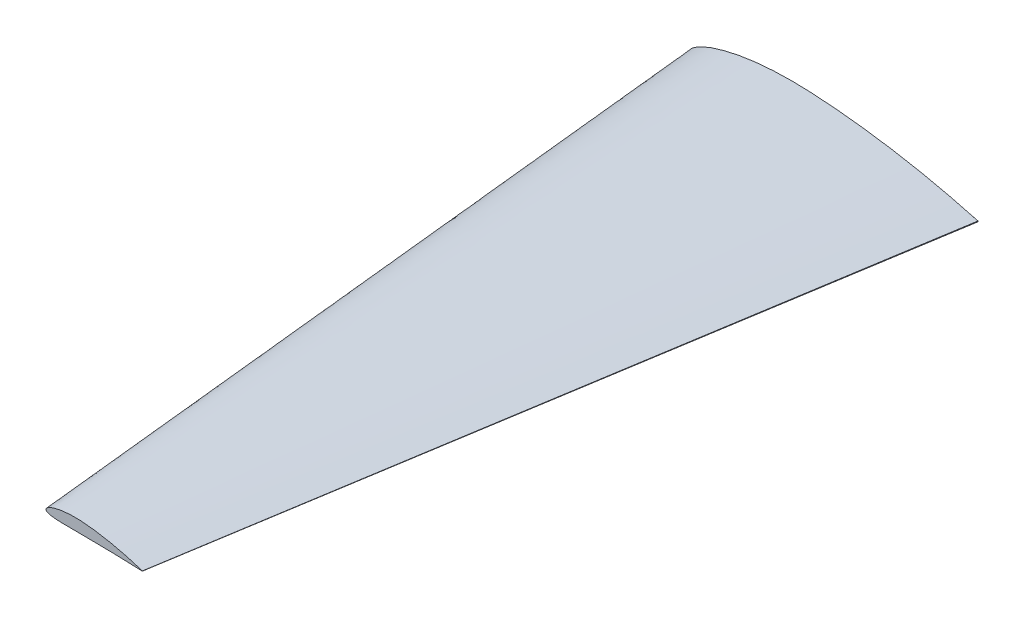
ISO-10303-21;
HEADER;
FILE_DESCRIPTION(('STEP AP214'),'2;1');
FILE_NAME('part.step','',(''),(''),'','','');
FILE_SCHEMA(('AUTOMOTIVE_DESIGN { 1 0 10303 214 1 1 1 1 }'));
ENDSEC;
DATA;
#1=APPLICATION_CONTEXT('core data for automotive mechanical design processes');
#2=APPLICATION_PROTOCOL_DEFINITION('international standard','automotive_design',2000,#1);
#3=PRODUCT_CONTEXT('',#1,'mechanical');
#4=PRODUCT('Part','Part','',(#3));
#5=PRODUCT_RELATED_PRODUCT_CATEGORY('part','',(#4));
#6=PRODUCT_DEFINITION_FORMATION('','',#4);
#7=PRODUCT_DEFINITION_CONTEXT('part definition',#1,'design');
#8=PRODUCT_DEFINITION('design','',#6,#7);
#9=PRODUCT_DEFINITION_SHAPE('','',#8);
#10=(LENGTH_UNIT() NAMED_UNIT(*) SI_UNIT(.MILLI.,.METRE.));
#11=(NAMED_UNIT(*) PLANE_ANGLE_UNIT() SI_UNIT($,.RADIAN.));
#12=(NAMED_UNIT(*) SI_UNIT($,.STERADIAN.) SOLID_ANGLE_UNIT());
#13=UNCERTAINTY_MEASURE_WITH_UNIT(LENGTH_MEASURE(1.E-05),#10,'distance_accuracy_value','');
#14=(GEOMETRIC_REPRESENTATION_CONTEXT(3) GLOBAL_UNCERTAINTY_ASSIGNED_CONTEXT((#13)) GLOBAL_UNIT_ASSIGNED_CONTEXT((#10,
#11,#12)) REPRESENTATION_CONTEXT('',''));
#15=CARTESIAN_POINT('',(0.,0.,0.));
#16=DIRECTION('',(0.,0.,1.));
#17=DIRECTION('',(1.,0.,0.));
#18=AXIS2_PLACEMENT_3D('',#15,#16,#17);
#19=CARTESIAN_POINT('',(5046.62444198474,563.879421682636,45000.));
#20=DIRECTION('',(0.,0.,-1.));
#21=DIRECTION('',(-1.,0.,0.));
#22=AXIS2_PLACEMENT_3D('',#19,#20,#21);
#23=PLANE('',#22);
#24=CARTESIAN_POINT('',(11016.8038358006,175.662220236248,45000.));
#25=CARTESIAN_POINT('',(11013.8238706951,176.657627238535,45000.));
#26=CARTESIAN_POINT('',(11001.9271551493,180.631524092771,45000.));
#27=CARTESIAN_POINT('',(10975.227247583,189.540370854684,45000.));
#28=CARTESIAN_POINT('',(10930.8719876282,204.188638264243,45000.));
#29=CARTESIAN_POINT('',(10869.1028475947,224.367251974922,45000.));
#30=CARTESIAN_POINT('',(10790.240197561,249.721214038469,45000.));
#31=CARTESIAN_POINT('',(10694.7071670468,279.852444771577,45000.));
#32=CARTESIAN_POINT('',(10583.0107951592,314.25724887763,45000.));
#33=CARTESIAN_POINT('',(10455.7658081857,352.424928205808,45000.));
#34=CARTESIAN_POINT('',(10313.6645243874,393.743241395522,45000.));
#35=CARTESIAN_POINT('',(10157.5038937566,437.61179958158,45000.));
#36=CARTESIAN_POINT('',(9988.16790311371,483.397295715831,45000.));
#37=CARTESIAN_POINT('',(9806.62258777869,530.438712455231,45000.));
#38=CARTESIAN_POINT('',(9613.9206331239,578.086856055864,45000.));
#39=CARTESIAN_POINT('',(9411.18705103645,625.683245725675,45000.));
#40=CARTESIAN_POINT('',(9199.62707490729,672.608611532407,45000.));
#41=CARTESIAN_POINT('',(8980.49871389045,718.206148862946,45000.));
#42=CARTESIAN_POINT('',(8755.12853528402,761.887650567427,45000.));
#43=CARTESIAN_POINT('',(8524.88852400964,803.055073268356,45000.));
#44=CARTESIAN_POINT('',(8291.19753823506,841.16709564249,45000.));
#45=CARTESIAN_POINT('',(8055.50670066197,875.681825668917,45000.));
#46=CARTESIAN_POINT('',(7819.29777675795,906.160762137395,45000.));
#47=CARTESIAN_POINT('',(7583.52793924022,932.16759647092,45000.));
#48=CARTESIAN_POINT('',(7349.0019488898,953.640706489979,45000.));
#49=CARTESIAN_POINT('',(7117.01517974219,967.459136040717,45000.));
#50=CARTESIAN_POINT('',(6889.75927460565,973.713744382,45000.));
#51=CARTESIAN_POINT('',(6669.52967646175,972.412306138709,45000.));
#52=CARTESIAN_POINT('',(6457.89509045152,963.836313841872,45000.));
#53=CARTESIAN_POINT('',(6256.36653642584,948.401623210838,45000.));
#54=CARTESIAN_POINT('',(6066.3666830865,926.647155129574,45000.));
#55=CARTESIAN_POINT('',(5889.23129506125,899.215177324151,45000.));
#56=CARTESIAN_POINT('',(5726.16725610352,866.882517038113,45000.));
#57=CARTESIAN_POINT('',(5578.2639607925,830.466340030042,45000.));
#58=CARTESIAN_POINT('',(5446.45986918676,790.830692752215,45000.));
#59=CARTESIAN_POINT('',(5331.54550327665,748.847706817672,45000.));
#60=CARTESIAN_POINT('',(5234.12689908883,705.372238642089,45000.));
#61=CARTESIAN_POINT('',(5154.63423606412,661.169496243238,45000.));
#62=CARTESIAN_POINT('',(5093.24012040514,616.816631391022,45000.));
#63=CARTESIAN_POINT('',(5049.90913796763,572.56653701901,45000.));
#64=CARTESIAN_POINT('',(5024.63929694074,527.608998184188,45000.));
#65=CARTESIAN_POINT('',(5020.17031135847,481.738654851406,45000.));
#66=CARTESIAN_POINT('',(5037.52570607464,439.134452359693,45000.));
#67=CARTESIAN_POINT('',(5074.07960988172,403.188963301013,45000.));
#68=CARTESIAN_POINT('',(5127.10419251011,372.557418098199,45000.));
#69=CARTESIAN_POINT('',(5196.64772829925,346.121915624728,45000.));
#70=CARTESIAN_POINT('',(5282.4915169243,323.532348684396,45000.));
#71=CARTESIAN_POINT('',(5384.22450862548,304.609019147802,45000.));
#72=CARTESIAN_POINT('',(5501.22322457257,289.204760371054,45000.));
#73=CARTESIAN_POINT('',(5632.74423119377,277.058590565351,45000.));
#74=CARTESIAN_POINT('',(5777.97145395365,267.923893569997,45000.));
#75=CARTESIAN_POINT('',(5936.01888618687,261.426029066467,45000.));
#76=CARTESIAN_POINT('',(6105.96028140851,257.165599955122,45000.));
#77=CARTESIAN_POINT('',(6286.82797064515,254.680445326503,45000.));
#78=CARTESIAN_POINT('',(6477.61628635329,253.447275004693,45000.));
#79=CARTESIAN_POINT('',(6677.28900613625,252.928162568892,45000.));
#80=CARTESIAN_POINT('',(6884.77024356208,252.569464820474,45000.));
#81=CARTESIAN_POINT('',(7098.95099407701,251.77941384682,45000.));
#82=CARTESIAN_POINT('',(7319.37877838889,250.077946129556,45000.));
#83=CARTESIAN_POINT('',(7545.36587973962,246.675283655304,45000.));
#84=CARTESIAN_POINT('',(7775.65160502419,244.007368227557,45000.));
#85=CARTESIAN_POINT('',(8008.16968243336,241.497238491779,45000.));
#86=CARTESIAN_POINT('',(8240.98559300548,238.966955247815,45000.));
#87=CARTESIAN_POINT('',(8472.69656296,236.18608009988,45000.));
#88=CARTESIAN_POINT('',(8701.89090570681,233.020542928767,45000.));
#89=CARTESIAN_POINT('',(8927.16322744528,229.3547831871,45000.));
#90=CARTESIAN_POINT('',(9147.12321082592,225.153795541316,45000.));
#91=CARTESIAN_POINT('',(9360.40325730438,220.426952399602,45000.));
#92=CARTESIAN_POINT('',(9565.6683928176,215.239469723458,45000.));
#93=CARTESIAN_POINT('',(9761.61908285512,209.669383936778,45000.));
#94=CARTESIAN_POINT('',(9947.01408470072,203.849892297003,45000.));
#95=CARTESIAN_POINT('',(10120.6648946521,197.91682065144,45000.));
#96=CARTESIAN_POINT('',(10281.4540059651,192.027799228579,45000.));
#97=CARTESIAN_POINT('',(10428.3328546008,186.307516445477,45000.));
#98=CARTESIAN_POINT('',(10560.338594395,180.924898710908,45000.));
#99=CARTESIAN_POINT('',(10676.5981472564,175.99075423297,45000.));
#100=CARTESIAN_POINT('',(10776.3350346384,171.633699664281,45000.));
#101=CARTESIAN_POINT('',(10858.8809220008,167.937636087378,45000.));
#102=CARTESIAN_POINT('',(10923.6749036572,164.977071033585,45000.));
#103=CARTESIAN_POINT('',(10970.2772887048,162.846735624516,45000.));
#104=CARTESIAN_POINT('',(10998.3639129717,161.509489926778,45000.));
#105=CARTESIAN_POINT('',(11011.5516219352,160.931286929275,45000.));
#106=CARTESIAN_POINT('',(11015.3523575084,160.730075398698,45000.));
#107=CARTESIAN_POINT('',(11016.0194244884,160.694760769346,45000.));
#108=B_SPLINE_CURVE_WITH_KNOTS('',3,(#24,#25,#26,#27,#28,#29,#30,#31,#32,#33,#34,#35,#36,#37,
#38,#39,#40,#41,#42,#43,#44,#45,#46,#47,#48,#49,#50,#51,#52,#53,#54,#55,#56,#57,#58,#59,#60,#61,
#62,#63,#64,#65,#66,#67,#68,#69,#70,#71,#72,#73,#74,#75,#76,#77,#78,#79,#80,#81,#82,#83,#84,#85,
#86,#87,#88,#89,#90,#91,#92,#93,#94,#95,#96,#97,#98,#99,#100,#101,#102,#103,#104,#105,#106,
#107),.UNSPECIFIED.,.F.,.F.,(4,1,1,1,1,1,1,1,1,1,1,1,1,1,1,1,1,1,1,1,1,1,1,1,1,1,1,1,1,1,1,1,1,
1,1,1,1,1,1,1,1,1,1,1,1,1,1,1,1,1,1,1,1,1,1,1,1,1,1,1,1,1,1,1,1,1,1,1,1,1,1,1,1,1,1,1,1,1,1,1,1,
4),(0.,0.000767121254640261,0.00306252691977081,0.00687249500422591,0.0121723886211334,
0.0189286897776406,0.0270985273547925,0.0366307244648695,0.0474652014577101,0.0595344883078078,
0.0727633066210751,0.0870694437086077,0.102364288210113,0.118553276218277,0.135536378611135,
0.153209328906051,0.171462740540865,0.190184209716801,0.209258972509244,0.228568672546341,
0.247994708125301,0.267417510782052,0.286717382026135,0.305907975532352,0.324913732729971,
0.343450270527452,0.361407243443232,0.37867648926581,0.395155680852941,0.410746411858504,
0.425359257634746,0.438909317349477,0.451323091037229,0.462536328216232,0.472498522944067,
0.481175411965611,0.488557733265764,0.494670875888975,0.499607077860304,0.503582011567533,
0.507027067193182,0.510471717375482,0.514433585416291,0.519323420502367,0.525336376275755,
0.532547811911357,0.540971207547999,0.550585893045097,0.561351783213653,0.573214660035621,
0.586111603768396,0.599971786160278,0.614720131432056,0.630276669804401,0.646556306621168,
0.663473292221445,0.680936327350333,0.698852005706235,0.717295175424184,0.736120434794262,
0.755083389680044,0.77407118766486,0.792969208077575,0.811663076825591,0.830037642898592,
0.847979966615464,0.86537924877782,0.882125799542238,0.898114379916224,0.913242734866341,
0.927414941899802,0.940538465376043,0.952528040305874,0.963304728991663,0.972796370859253,
0.98094005879009,0.987680175393795,0.992971347205831,0.996776972988148,0.999070696658573,
0.99983689800001,1.),.UNSPECIFIED.);
#109=CARTESIAN_POINT('',(11016.8038358006,175.662220236248,45000.));
#110=VERTEX_POINT('',#109);
#111=CARTESIAN_POINT('',(11016.0194244884,160.694760769346,45000.));
#112=VERTEX_POINT('',#111);
#113=EDGE_CURVE('E68',#110,#112,#108,.T.);
#114=ORIENTED_EDGE('',*,*,#113,.T.);
#115=DIRECTION('',(0.0523359562429645,0.998629534754573,0.));
#116=VECTOR('',#115,1.);
#117=CARTESIAN_POINT('',(11016.8038358006,175.662220236248,45000.));
#118=LINE('',#117,#116);
#119=EDGE_CURVE('E12',#112,#110,#118,.T.);
#120=ORIENTED_EDGE('',*,*,#119,.T.);
#121=EDGE_LOOP('',(#114,#120));
#122=FACE_BOUND('',#121,.T.);
#123=ADVANCED_FACE('F58',(#122),#23,.F.);
#124=CARTESIAN_POINT('',(56.0604332540928,248.172347240574,0.));
#125=DIRECTION('',(0.,0.,-1.));
#126=DIRECTION('',(-1.,0.,0.));
#127=AXIS2_PLACEMENT_3D('',#124,#125,#126);
#128=PLANE('',#127);
#129=CARTESIAN_POINT('',(18003.006,22.482,0.));
#130=CARTESIAN_POINT('',(17993.9220697674,24.9962505246562,0.));
#131=CARTESIAN_POINT('',(17957.6569021601,35.0337248720699,0.));
#132=CARTESIAN_POINT('',(17876.2681943043,57.5315417809718,0.));
#133=CARTESIAN_POINT('',(17741.08488322,94.4519943530551,0.));
#134=CARTESIAN_POINT('',(17552.863219366,145.206632188856,0.));
#135=CARTESIAN_POINT('',(17312.6187332804,208.782221603863,0.));
#136=CARTESIAN_POINT('',(17021.6815755125,284.052594875379,0.));
#137=CARTESIAN_POINT('',(16681.6498628702,369.588346133817,0.));
#138=CARTESIAN_POINT('',(16294.4454304608,463.955997473154,0.));
#139=CARTESIAN_POINT('',(15862.2385133852,565.430041392831,0.));
#140=CARTESIAN_POINT('',(15387.5109508185,672.33690715322,0.));
#141=CARTESIAN_POINT('',(14873.0105029931,782.918070272461,0.));
#142=CARTESIAN_POINT('',(14321.7350890392,895.344871571994,0.));
#143=CARTESIAN_POINT('',(13736.940365594,1007.83767879923,0.));
#144=CARTESIAN_POINT('',(13122.1001296153,1118.60039257179,0.));
#145=CARTESIAN_POINT('',(12480.9223563371,1225.96698028273,0.));
#146=CARTESIAN_POINT('',(11817.2790245401,1328.16724581248,0.));
#147=CARTESIAN_POINT('',(11135.2367352268,1423.64726756803,0.));
#148=CARTESIAN_POINT('',(10438.999699905,1510.83078663836,0.));
#149=CARTESIAN_POINT('',(9732.90365129785,1588.31883653686,0.));
#150=CARTESIAN_POINT('',(9021.38107268206,1654.71580681601,0.));
#151=CARTESIAN_POINT('',(8308.94001647658,1708.9406455351,0.));
#152=CARTESIAN_POINT('',(7598.51656939702,1749.83650444868,0.));
#153=CARTESIAN_POINT('',(6892.53138026345,1777.34512414645,0.));
#154=CARTESIAN_POINT('',(6195.35526006124,1782.31985156917,0.));
#155=CARTESIAN_POINT('',(5513.53986088564,1765.37699610142,0.));
#156=CARTESIAN_POINT('',(4853.96085352959,1726.90025226361,0.));
#157=CARTESIAN_POINT('',(4221.27370730624,1667.97923937249,0.));
#158=CARTESIAN_POINT('',(3619.93997674745,1590.09705684506,0.));
#159=CARTESIAN_POINT('',(3054.13720398511,1495.09162179699,0.));
#160=CARTESIAN_POINT('',(2527.76634995866,1385.096822347,0.));
#161=CARTESIAN_POINT('',(2044.32113596184,1262.62943662746,0.));
#162=CARTESIAN_POINT('',(1606.93696534578,1130.30864574338,0.));
#163=CARTESIAN_POINT('',(1218.2896978136,990.870382228364,0.));
#164=CARTESIAN_POINT('',(880.610717661754,847.051573416231,0.));
#165=CARTESIAN_POINT('',(595.581422132434,701.508426325905,0.));
#166=CARTESIAN_POINT('',(364.370437230143,556.600960494894,0.));
#167=CARTESIAN_POINT('',(187.404254541008,414.085358865581,0.));
#168=CARTESIAN_POINT('',(64.5370710533379,274.713700196437,0.));
#169=CARTESIAN_POINT('',(-4.10987035494065,136.058358042702,0.));
#170=CARTESIAN_POINT('',(-10.2964484889275,-2.06574672329666,0.));
#171=CARTESIAN_POINT('',(48.3875757958354,-126.978257926631,0.));
#172=CARTESIAN_POINT('',(163.542724280357,-228.927688441748,0.));
#173=CARTESIAN_POINT('',(327.207860750736,-312.371108937129,0.));
#174=CARTESIAN_POINT('',(539.703129023767,-380.650047207266,0.));
#175=CARTESIAN_POINT('',(800.428296873182,-434.84772308343,0.));
#176=CARTESIAN_POINT('',(1108.18011902821,-475.567030190427,0.));
#177=CARTESIAN_POINT('',(1461.11382868748,-503.346754481954,0.));
#178=CARTESIAN_POINT('',(1857.04315787962,-519.085493245649,0.));
#179=CARTESIAN_POINT('',(2293.56195888155,-523.650211150495,0.));
#180=CARTESIAN_POINT('',(2768.07467589918,-518.302398875668,0.));
#181=CARTESIAN_POINT('',(3277.86908613102,-504.384033627065,0.));
#182=CARTESIAN_POINT('',(3820.11872402627,-483.431629649826,0.));
#183=CARTESIAN_POINT('',(4391.89288232696,-457.170803736354,0.));
#184=CARTESIAN_POINT('',(4990.17161284425,-427.37581859069,0.));
#185=CARTESIAN_POINT('',(5611.81860601584,-395.874250198099,0.));
#186=CARTESIAN_POINT('',(6253.60431995573,-364.613091745766,0.));
#187=CARTESIAN_POINT('',(6914.24855085877,-335.101602867013,0.));
#188=CARTESIAN_POINT('',(7591.8149772891,-309.813847454495,0.));
#189=CARTESIAN_POINT('',(8282.14424110902,-281.649953956018,0.));
#190=CARTESIAN_POINT('',(8979.1366096245,-252.662855251721,0.));
#191=CARTESIAN_POINT('',(9677.02441737823,-223.68937206278,0.));
#192=CARTESIAN_POINT('',(10371.641291028,-195.64011867471,0.));
#193=CARTESIAN_POINT('',(11058.7790248695,-169.138400132639,0.));
#194=CARTESIAN_POINT('',(11734.2453595462,-144.751080848916,0.));
#195=CARTESIAN_POINT('',(12393.8805552671,-122.801323667347,0.));
#196=CARTESIAN_POINT('',(13033.5859675962,-103.47577362978,0.));
#197=CARTESIAN_POINT('',(13649.351923532,-86.7886524127904,0.));
#198=CARTESIAN_POINT('',(14237.272910111,-72.7102087271436,0.));
#199=CARTESIAN_POINT('',(14793.6093894072,-61.0362833005955,0.));
#200=CARTESIAN_POINT('',(15314.7794109959,-51.5465614583088,0.));
#201=CARTESIAN_POINT('',(15797.4102999706,-43.9442579472748,0.));
#202=CARTESIAN_POINT('',(16238.3410982139,-38.0204529646997,0.));
#203=CARTESIAN_POINT('',(16634.6607030993,-33.4202362317489,0.));
#204=CARTESIAN_POINT('',(16983.736072162,-29.9487188308591,0.));
#205=CARTESIAN_POINT('',(17283.2207683463,-27.3424928398559,0.));
#206=CARTESIAN_POINT('',(17531.0993626893,-25.455133743419,0.));
#207=CARTESIAN_POINT('',(17725.6797459678,-24.1514918839373,0.));
#208=CARTESIAN_POINT('',(17865.6297796858,-23.2167983052178,0.));
#209=CARTESIAN_POINT('',(17949.9841353559,-22.8132164362509,0.));
#210=CARTESIAN_POINT('',(17989.5838247764,-22.474874129643,0.));
#211=CARTESIAN_POINT('',(18001.0019969618,-22.4809360691834,0.));
#212=CARTESIAN_POINT('',(18003.006,-22.482,0.));
#213=B_SPLINE_CURVE_WITH_KNOTS('',3,(#129,#130,#131,#132,#133,#134,#135,#136,#137,#138,#139,
#140,#141,#142,#143,#144,#145,#146,#147,#148,#149,#150,#151,#152,#153,#154,#155,#156,#157,#158,
#159,#160,#161,#162,#163,#164,#165,#166,#167,#168,#169,#170,#171,#172,#173,#174,#175,#176,#177,
#178,#179,#180,#181,#182,#183,#184,#185,#186,#187,#188,#189,#190,#191,#192,#193,#194,#195,#196,
#197,#198,#199,#200,#201,#202,#203,#204,#205,#206,#207,#208,#209,#210,#211,#212),.UNSPECIFIED.,
.F.,.F.,(4,1,1,1,1,1,1,1,1,1,1,1,1,1,1,1,1,1,1,1,1,1,1,1,1,1,1,1,1,1,1,1,1,1,1,1,1,1,1,1,1,1,1,
1,1,1,1,1,1,1,1,1,1,1,1,1,1,1,1,1,1,1,1,1,1,1,1,1,1,1,1,1,1,1,1,1,1,1,1,1,1,4),(0.,
0.000767121254640261,0.00306252691977081,0.00687249500422591,0.0121723886211334,
0.0189286897776406,0.0270985273547925,0.0366307244648695,0.0474652014577101,0.0595344883078078,
0.0727633066210751,0.0870694437086077,0.102364288210113,0.118553276218277,0.135536378611135,
0.153209328906051,0.171462740540865,0.190184209716801,0.209258972509244,0.228568672546341,
0.247994708125301,0.267417510782052,0.286717382026135,0.305907975532352,0.324913732729971,
0.343450270527452,0.361407243443232,0.37867648926581,0.395155680852941,0.410746411858504,
0.425359257634746,0.438909317349477,0.451323091037229,0.462536328216232,0.472498522944067,
0.481175411965611,0.488557733265764,0.494670875888975,0.499607077860304,0.503582011567533,
0.507027067193182,0.510471717375482,0.514433585416291,0.519323420502367,0.525336376275755,
0.532547811911357,0.540971207547999,0.550585893045097,0.561351783213653,0.573214660035621,
0.586111603768396,0.599971786160278,0.614720131432056,0.630276669804401,0.646556306621168,
0.663473292221445,0.680936327350333,0.698852005706235,0.717295175424184,0.736120434794262,
0.755083389680044,0.77407118766486,0.792969208077575,0.811663076825591,0.830037642898592,
0.847979966615464,0.86537924877782,0.882125799542238,0.898114379916224,0.913242734866341,
0.927414941899802,0.940538465376043,0.952528040305874,0.963304728991663,0.972796370859253,
0.98094005879009,0.987680175393795,0.992971347205831,0.996776972988148,0.999070696658573,
0.99983689800001,1.),.UNSPECIFIED.);
#214=CARTESIAN_POINT('',(18003.006,22.482,0.));
#215=VERTEX_POINT('',#214);
#216=CARTESIAN_POINT('',(18003.006,-22.482,0.));
#217=VERTEX_POINT('',#216);
#218=EDGE_CURVE('E92',#215,#217,#213,.T.);
#219=ORIENTED_EDGE('',*,*,#218,.F.);
#220=DIRECTION('',(0.,1.,0.));
#221=VECTOR('',#220,1.);
#222=CARTESIAN_POINT('',(18003.006,22.482,0.));
#223=LINE('',#222,#221);
#224=EDGE_CURVE('E96',#217,#215,#223,.T.);
#225=ORIENTED_EDGE('',*,*,#224,.F.);
#226=EDGE_LOOP('',(#219,#225));
#227=FACE_BOUND('',#226,.T.);
#228=ADVANCED_FACE('F105',(#227),#128,.T.);
#229=CARTESIAN_POINT('',(18003.006,22.482,0.));
#230=CARTESIAN_POINT('',(11016.8038358006,175.662220236248,45000.));
#231=CARTESIAN_POINT('',(17993.9220697674,24.9962505246562,0.));
#232=CARTESIAN_POINT('',(11013.8238706951,176.657627238535,45000.));
#233=CARTESIAN_POINT('',(17957.6569021601,35.0337248720699,0.));
#234=CARTESIAN_POINT('',(11001.9271551493,180.631524092771,45000.));
#235=CARTESIAN_POINT('',(17876.2681943043,57.5315417809718,0.));
#236=CARTESIAN_POINT('',(10975.227247583,189.540370854684,45000.));
#237=CARTESIAN_POINT('',(17741.08488322,94.4519943530551,0.));
#238=CARTESIAN_POINT('',(10930.8719876282,204.188638264243,45000.));
#239=CARTESIAN_POINT('',(17552.863219366,145.206632188856,0.));
#240=CARTESIAN_POINT('',(10869.1028475947,224.367251974922,45000.));
#241=CARTESIAN_POINT('',(17312.6187332804,208.782221603863,0.));
#242=CARTESIAN_POINT('',(10790.240197561,249.721214038469,45000.));
#243=CARTESIAN_POINT('',(17021.6815755125,284.052594875379,0.));
#244=CARTESIAN_POINT('',(10694.7071670468,279.852444771577,45000.));
#245=CARTESIAN_POINT('',(16681.6498628702,369.588346133817,0.));
#246=CARTESIAN_POINT('',(10583.0107951592,314.25724887763,45000.));
#247=CARTESIAN_POINT('',(16294.4454304608,463.955997473154,0.));
#248=CARTESIAN_POINT('',(10455.7658081857,352.424928205808,45000.));
#249=CARTESIAN_POINT('',(15862.2385133852,565.430041392831,0.));
#250=CARTESIAN_POINT('',(10313.6645243874,393.743241395522,45000.));
#251=CARTESIAN_POINT('',(15387.5109508185,672.33690715322,0.));
#252=CARTESIAN_POINT('',(10157.5038937566,437.61179958158,45000.));
#253=CARTESIAN_POINT('',(14873.0105029931,782.918070272461,0.));
#254=CARTESIAN_POINT('',(9988.16790311371,483.397295715831,45000.));
#255=CARTESIAN_POINT('',(14321.7350890392,895.344871571994,0.));
#256=CARTESIAN_POINT('',(9806.62258777869,530.438712455231,45000.));
#257=CARTESIAN_POINT('',(13736.940365594,1007.83767879923,0.));
#258=CARTESIAN_POINT('',(9613.9206331239,578.086856055864,45000.));
#259=CARTESIAN_POINT('',(13122.1001296153,1118.60039257179,0.));
#260=CARTESIAN_POINT('',(9411.18705103645,625.683245725675,45000.));
#261=CARTESIAN_POINT('',(12480.9223563371,1225.96698028273,0.));
#262=CARTESIAN_POINT('',(9199.62707490729,672.608611532407,45000.));
#263=CARTESIAN_POINT('',(11817.2790245401,1328.16724581248,0.));
#264=CARTESIAN_POINT('',(8980.49871389045,718.206148862946,45000.));
#265=CARTESIAN_POINT('',(11135.2367352268,1423.64726756803,0.));
#266=CARTESIAN_POINT('',(8755.12853528402,761.887650567427,45000.));
#267=CARTESIAN_POINT('',(10438.999699905,1510.83078663836,0.));
#268=CARTESIAN_POINT('',(8524.88852400964,803.055073268356,45000.));
#269=CARTESIAN_POINT('',(9732.90365129785,1588.31883653686,0.));
#270=CARTESIAN_POINT('',(8291.19753823506,841.16709564249,45000.));
#271=CARTESIAN_POINT('',(9021.38107268206,1654.71580681601,0.));
#272=CARTESIAN_POINT('',(8055.50670066197,875.681825668917,45000.));
#273=CARTESIAN_POINT('',(8308.94001647658,1708.9406455351,0.));
#274=CARTESIAN_POINT('',(7819.29777675795,906.160762137395,45000.));
#275=CARTESIAN_POINT('',(7598.51656939702,1749.83650444868,0.));
#276=CARTESIAN_POINT('',(7583.52793924022,932.16759647092,45000.));
#277=CARTESIAN_POINT('',(6892.53138026345,1777.34512414645,0.));
#278=CARTESIAN_POINT('',(7349.0019488898,953.640706489979,45000.));
#279=CARTESIAN_POINT('',(6195.35526006124,1782.31985156917,0.));
#280=CARTESIAN_POINT('',(7117.01517974219,967.459136040717,45000.));
#281=CARTESIAN_POINT('',(5513.53986088564,1765.37699610142,0.));
#282=CARTESIAN_POINT('',(6889.75927460565,973.713744382,45000.));
#283=CARTESIAN_POINT('',(4853.96085352959,1726.90025226361,0.));
#284=CARTESIAN_POINT('',(6669.52967646175,972.412306138709,45000.));
#285=CARTESIAN_POINT('',(4221.27370730624,1667.97923937249,0.));
#286=CARTESIAN_POINT('',(6457.89509045152,963.836313841872,45000.));
#287=CARTESIAN_POINT('',(3619.93997674745,1590.09705684506,0.));
#288=CARTESIAN_POINT('',(6256.36653642584,948.401623210838,45000.));
#289=CARTESIAN_POINT('',(3054.13720398511,1495.09162179699,0.));
#290=CARTESIAN_POINT('',(6066.3666830865,926.647155129574,45000.));
#291=CARTESIAN_POINT('',(2527.76634995866,1385.096822347,0.));
#292=CARTESIAN_POINT('',(5889.23129506125,899.215177324151,45000.));
#293=CARTESIAN_POINT('',(2044.32113596184,1262.62943662746,0.));
#294=CARTESIAN_POINT('',(5726.16725610352,866.882517038113,45000.));
#295=CARTESIAN_POINT('',(1606.93696534578,1130.30864574338,0.));
#296=CARTESIAN_POINT('',(5578.2639607925,830.466340030042,45000.));
#297=CARTESIAN_POINT('',(1218.2896978136,990.870382228364,0.));
#298=CARTESIAN_POINT('',(5446.45986918676,790.830692752215,45000.));
#299=CARTESIAN_POINT('',(880.610717661754,847.051573416231,0.));
#300=CARTESIAN_POINT('',(5331.54550327665,748.847706817672,45000.));
#301=CARTESIAN_POINT('',(595.581422132434,701.508426325905,0.));
#302=CARTESIAN_POINT('',(5234.12689908883,705.372238642089,45000.));
#303=CARTESIAN_POINT('',(364.370437230143,556.600960494894,0.));
#304=CARTESIAN_POINT('',(5154.63423606412,661.169496243238,45000.));
#305=CARTESIAN_POINT('',(187.404254541008,414.085358865581,0.));
#306=CARTESIAN_POINT('',(5093.24012040514,616.816631391022,45000.));
#307=CARTESIAN_POINT('',(64.5370710533379,274.713700196437,0.));
#308=CARTESIAN_POINT('',(5049.90913796763,572.56653701901,45000.));
#309=CARTESIAN_POINT('',(-4.10987035494065,136.058358042702,0.));
#310=CARTESIAN_POINT('',(5024.63929694074,527.608998184188,45000.));
#311=CARTESIAN_POINT('',(-10.2964484889275,-2.06574672329666,0.));
#312=CARTESIAN_POINT('',(5020.17031135847,481.738654851406,45000.));
#313=CARTESIAN_POINT('',(48.3875757958354,-126.978257926631,0.));
#314=CARTESIAN_POINT('',(5037.52570607464,439.134452359693,45000.));
#315=CARTESIAN_POINT('',(163.542724280357,-228.927688441748,0.));
#316=CARTESIAN_POINT('',(5074.07960988172,403.188963301013,45000.));
#317=CARTESIAN_POINT('',(327.207860750736,-312.371108937129,0.));
#318=CARTESIAN_POINT('',(5127.10419251011,372.557418098199,45000.));
#319=CARTESIAN_POINT('',(539.703129023767,-380.650047207266,0.));
#320=CARTESIAN_POINT('',(5196.64772829925,346.121915624728,45000.));
#321=CARTESIAN_POINT('',(800.428296873182,-434.84772308343,0.));
#322=CARTESIAN_POINT('',(5282.4915169243,323.532348684396,45000.));
#323=CARTESIAN_POINT('',(1108.18011902821,-475.567030190427,0.));
#324=CARTESIAN_POINT('',(5384.22450862548,304.609019147802,45000.));
#325=CARTESIAN_POINT('',(1461.11382868748,-503.346754481954,0.));
#326=CARTESIAN_POINT('',(5501.22322457257,289.204760371054,45000.));
#327=CARTESIAN_POINT('',(1857.04315787962,-519.085493245649,0.));
#328=CARTESIAN_POINT('',(5632.74423119377,277.058590565351,45000.));
#329=CARTESIAN_POINT('',(2293.56195888155,-523.650211150495,0.));
#330=CARTESIAN_POINT('',(5777.97145395365,267.923893569997,45000.));
#331=CARTESIAN_POINT('',(2768.07467589918,-518.302398875668,0.));
#332=CARTESIAN_POINT('',(5936.01888618687,261.426029066467,45000.));
#333=CARTESIAN_POINT('',(3277.86908613102,-504.384033627065,0.));
#334=CARTESIAN_POINT('',(6105.96028140851,257.165599955122,45000.));
#335=CARTESIAN_POINT('',(3820.11872402627,-483.431629649826,0.));
#336=CARTESIAN_POINT('',(6286.82797064515,254.680445326503,45000.));
#337=CARTESIAN_POINT('',(4391.89288232696,-457.170803736354,0.));
#338=CARTESIAN_POINT('',(6477.61628635329,253.447275004693,45000.));
#339=CARTESIAN_POINT('',(4990.17161284425,-427.37581859069,0.));
#340=CARTESIAN_POINT('',(6677.28900613625,252.928162568892,45000.));
#341=CARTESIAN_POINT('',(5611.81860601584,-395.874250198099,0.));
#342=CARTESIAN_POINT('',(6884.77024356208,252.569464820474,45000.));
#343=CARTESIAN_POINT('',(6253.60431995573,-364.613091745766,0.));
#344=CARTESIAN_POINT('',(7098.95099407701,251.77941384682,45000.));
#345=CARTESIAN_POINT('',(6914.24855085877,-335.101602867013,0.));
#346=CARTESIAN_POINT('',(7319.37877838889,250.077946129556,45000.));
#347=CARTESIAN_POINT('',(7591.8149772891,-309.813847454495,0.));
#348=CARTESIAN_POINT('',(7545.36587973962,246.675283655304,45000.));
#349=CARTESIAN_POINT('',(8282.14424110902,-281.649953956018,0.));
#350=CARTESIAN_POINT('',(7775.65160502419,244.007368227557,45000.));
#351=CARTESIAN_POINT('',(8979.1366096245,-252.662855251721,0.));
#352=CARTESIAN_POINT('',(8008.16968243336,241.497238491779,45000.));
#353=CARTESIAN_POINT('',(9677.02441737823,-223.68937206278,0.));
#354=CARTESIAN_POINT('',(8240.98559300548,238.966955247815,45000.));
#355=CARTESIAN_POINT('',(10371.641291028,-195.64011867471,0.));
#356=CARTESIAN_POINT('',(8472.69656296,236.18608009988,45000.));
#357=CARTESIAN_POINT('',(11058.7790248695,-169.138400132639,0.));
#358=CARTESIAN_POINT('',(8701.89090570681,233.020542928767,45000.));
#359=CARTESIAN_POINT('',(11734.2453595462,-144.751080848916,0.));
#360=CARTESIAN_POINT('',(8927.16322744528,229.3547831871,45000.));
#361=CARTESIAN_POINT('',(12393.8805552671,-122.801323667347,0.));
#362=CARTESIAN_POINT('',(9147.12321082592,225.153795541316,45000.));
#363=CARTESIAN_POINT('',(13033.5859675962,-103.47577362978,0.));
#364=CARTESIAN_POINT('',(9360.40325730438,220.426952399602,45000.));
#365=CARTESIAN_POINT('',(13649.351923532,-86.7886524127904,0.));
#366=CARTESIAN_POINT('',(9565.6683928176,215.239469723458,45000.));
#367=CARTESIAN_POINT('',(14237.272910111,-72.7102087271436,0.));
#368=CARTESIAN_POINT('',(9761.61908285512,209.669383936778,45000.));
#369=CARTESIAN_POINT('',(14793.6093894072,-61.0362833005955,0.));
#370=CARTESIAN_POINT('',(9947.01408470072,203.849892297003,45000.));
#371=CARTESIAN_POINT('',(15314.7794109959,-51.5465614583088,0.));
#372=CARTESIAN_POINT('',(10120.6648946521,197.91682065144,45000.));
#373=CARTESIAN_POINT('',(15797.4102999706,-43.9442579472748,0.));
#374=CARTESIAN_POINT('',(10281.4540059651,192.027799228579,45000.));
#375=CARTESIAN_POINT('',(16238.3410982139,-38.0204529646997,0.));
#376=CARTESIAN_POINT('',(10428.3328546008,186.307516445477,45000.));
#377=CARTESIAN_POINT('',(16634.6607030993,-33.4202362317489,0.));
#378=CARTESIAN_POINT('',(10560.338594395,180.924898710908,45000.));
#379=CARTESIAN_POINT('',(16983.736072162,-29.9487188308591,0.));
#380=CARTESIAN_POINT('',(10676.5981472564,175.99075423297,45000.));
#381=CARTESIAN_POINT('',(17283.2207683463,-27.3424928398559,0.));
#382=CARTESIAN_POINT('',(10776.3350346384,171.633699664281,45000.));
#383=CARTESIAN_POINT('',(17531.0993626893,-25.455133743419,0.));
#384=CARTESIAN_POINT('',(10858.8809220008,167.937636087378,45000.));
#385=CARTESIAN_POINT('',(17725.6797459678,-24.1514918839373,0.));
#386=CARTESIAN_POINT('',(10923.6749036572,164.977071033585,45000.));
#387=CARTESIAN_POINT('',(17865.6297796858,-23.2167983052178,0.));
#388=CARTESIAN_POINT('',(10970.2772887048,162.846735624516,45000.));
#389=CARTESIAN_POINT('',(17949.9841353559,-22.8132164362509,0.));
#390=CARTESIAN_POINT('',(10998.3639129717,161.509489926778,45000.));
#391=CARTESIAN_POINT('',(17989.5838247764,-22.474874129643,0.));
#392=CARTESIAN_POINT('',(11011.5516219352,160.931286929275,45000.));
#393=CARTESIAN_POINT('',(18001.0019969618,-22.4809360691834,0.));
#394=CARTESIAN_POINT('',(11015.3523575084,160.730075398698,45000.));
#395=CARTESIAN_POINT('',(18003.006,-22.482,0.));
#396=CARTESIAN_POINT('',(11016.0194244884,160.694760769346,45000.));
#397=B_SPLINE_SURFACE_WITH_KNOTS('',3,1,((#229,#230),(#231,#232),(#233,#234),(#235,#236),(#237,
#238),(#239,#240),(#241,#242),(#243,#244),(#245,#246),(#247,#248),(#249,#250),(#251,#252),(#253,
#254),(#255,#256),(#257,#258),(#259,#260),(#261,#262),(#263,#264),(#265,#266),(#267,#268),(#269,
#270),(#271,#272),(#273,#274),(#275,#276),(#277,#278),(#279,#280),(#281,#282),(#283,#284),(#285,
#286),(#287,#288),(#289,#290),(#291,#292),(#293,#294),(#295,#296),(#297,#298),(#299,#300),(#301,
#302),(#303,#304),(#305,#306),(#307,#308),(#309,#310),(#311,#312),(#313,#314),(#315,#316),(#317,
#318),(#319,#320),(#321,#322),(#323,#324),(#325,#326),(#327,#328),(#329,#330),(#331,#332),(#333,
#334),(#335,#336),(#337,#338),(#339,#340),(#341,#342),(#343,#344),(#345,#346),(#347,#348),(#349,
#350),(#351,#352),(#353,#354),(#355,#356),(#357,#358),(#359,#360),(#361,#362),(#363,#364),(#365,
#366),(#367,#368),(#369,#370),(#371,#372),(#373,#374),(#375,#376),(#377,#378),(#379,#380),(#381,
#382),(#383,#384),(#385,#386),(#387,#388),(#389,#390),(#391,#392),(#393,#394),(#395,#396)),
.UNSPECIFIED.,.F.,.F.,.F.,(4,1,1,1,1,1,1,1,1,1,1,1,1,1,1,1,1,1,1,1,1,1,1,1,1,1,1,1,1,1,1,1,1,1,
1,1,1,1,1,1,1,1,1,1,1,1,1,1,1,1,1,1,1,1,1,1,1,1,1,1,1,1,1,1,1,1,1,1,1,1,1,1,1,1,1,1,1,1,1,1,1,
4),(2,2),(0.,0.000767121254640261,0.00306252691977081,0.00687249500422591,0.0121723886211334,
0.0189286897776406,0.0270985273547925,0.0366307244648695,0.0474652014577101,0.0595344883078079,
0.0727633066210751,0.0870694437086077,0.102364288210113,0.118553276218277,0.135536378611135,
0.153209328906051,0.171462740540865,0.190184209716801,0.209258972509244,0.228568672546341,
0.247994708125302,0.267417510782052,0.286717382026135,0.305907975532352,0.324913732729971,
0.343450270527452,0.361407243443232,0.378676489265811,0.395155680852941,0.410746411858504,
0.425359257634747,0.438909317349477,0.451323091037229,0.462536328216232,0.472498522944067,
0.481175411965611,0.488557733265764,0.494670875888976,0.499607077860304,0.503582011567533,
0.507027067193182,0.510471717375482,0.514433585416292,0.519323420502367,0.525336376275755,
0.532547811911357,0.540971207547999,0.550585893045097,0.561351783213653,0.573214660035621,
0.586111603768397,0.599971786160278,0.614720131432056,0.630276669804401,0.646556306621168,
0.663473292221445,0.680936327350333,0.698852005706235,0.717295175424184,0.736120434794262,
0.755083389680044,0.77407118766486,0.792969208077575,0.811663076825592,0.830037642898592,
0.847979966615464,0.86537924877782,0.882125799542239,0.898114379916224,0.913242734866341,
0.927414941899802,0.940538465376043,0.952528040305875,0.963304728991664,0.972796370859253,
0.98094005879009,0.987680175393796,0.992971347205831,0.996776972988148,0.999070696658574,
0.99983689800001,1.),(0.,1.),.UNSPECIFIED.);
#398=DIRECTION('',(-0.153426747171754,0.00402236561621582,0.988151837435495));
#399=VECTOR('',#398,1.);
#400=CARTESIAN_POINT('',(14509.5127122442,69.1063803846732,22500.));
#401=LINE('',#400,#399);
#402=EDGE_CURVE('E76',#217,#112,#401,.T.);
#403=DIRECTION('',(0.153410300923283,-0.00336369076210816,-0.988156852506263));
#404=VECTOR('',#403,1.);
#405=CARTESIAN_POINT('',(14509.9049179003,99.072110118124,22500.));
#406=LINE('',#405,#404);
#407=EDGE_CURVE('E88',#110,#215,#406,.T.);
#408=ORIENTED_EDGE('',*,*,#218,.T.);
#409=ORIENTED_EDGE('',*,*,#402,.T.);
#410=ORIENTED_EDGE('',*,*,#113,.F.);
#411=ORIENTED_EDGE('',*,*,#407,.T.);
#412=EDGE_LOOP('',(#408,#409,#410,#411));
#413=FACE_BOUND('',#412,.T.);
#414=ADVANCED_FACE('F90',(#413),#397,.T.);
#415=CARTESIAN_POINT('',(18003.006,-22.482,0.));
#416=CARTESIAN_POINT('',(11016.0194244884,160.694760769346,45000.));
#417=CARTESIAN_POINT('',(18003.006,-14.988,0.));
#418=CARTESIAN_POINT('',(11016.1501597071,163.189337347163,45000.));
#419=CARTESIAN_POINT('',(18003.006,-7.494,0.));
#420=CARTESIAN_POINT('',(11016.2808949258,165.68391392498,45000.));
#421=CARTESIAN_POINT('',(18003.006,7.494,0.));
#422=CARTESIAN_POINT('',(11016.5423653632,170.673067080614,45000.));
#423=CARTESIAN_POINT('',(18003.006,14.988,0.));
#424=CARTESIAN_POINT('',(11016.6731005819,173.167643658431,45000.));
#425=CARTESIAN_POINT('',(18003.006,22.482,0.));
#426=CARTESIAN_POINT('',(11016.8038358006,175.662220236248,45000.));
#427=B_SPLINE_SURFACE_WITH_KNOTS('',3,1,((#415,#416),(#417,#418),(#419,#420),(#421,#422),(#423,
#424),(#425,#426)),.UNSPECIFIED.,.F.,.F.,.F.,(4,2,4),(2,2),(0.,0.5,1.),(0.,1.),.UNSPECIFIED.);
#428=ORIENTED_EDGE('',*,*,#224,.T.);
#429=ORIENTED_EDGE('',*,*,#407,.F.);
#430=ORIENTED_EDGE('',*,*,#119,.F.);
#431=ORIENTED_EDGE('',*,*,#402,.F.);
#432=EDGE_LOOP('',(#428,#429,#430,#431));
#433=FACE_BOUND('',#432,.T.);
#434=ADVANCED_FACE('F99',(#433),#427,.T.);
#435=CLOSED_SHELL('',(#123,#228,#414,#434));
#436=MANIFOLD_SOLID_BREP('B2',#435);
#437=ADVANCED_BREP_SHAPE_REPRESENTATION('',(#18,#436),#14);
#438=SHAPE_DEFINITION_REPRESENTATION(#9,#437);
ENDSEC;
END-ISO-10303-21;
